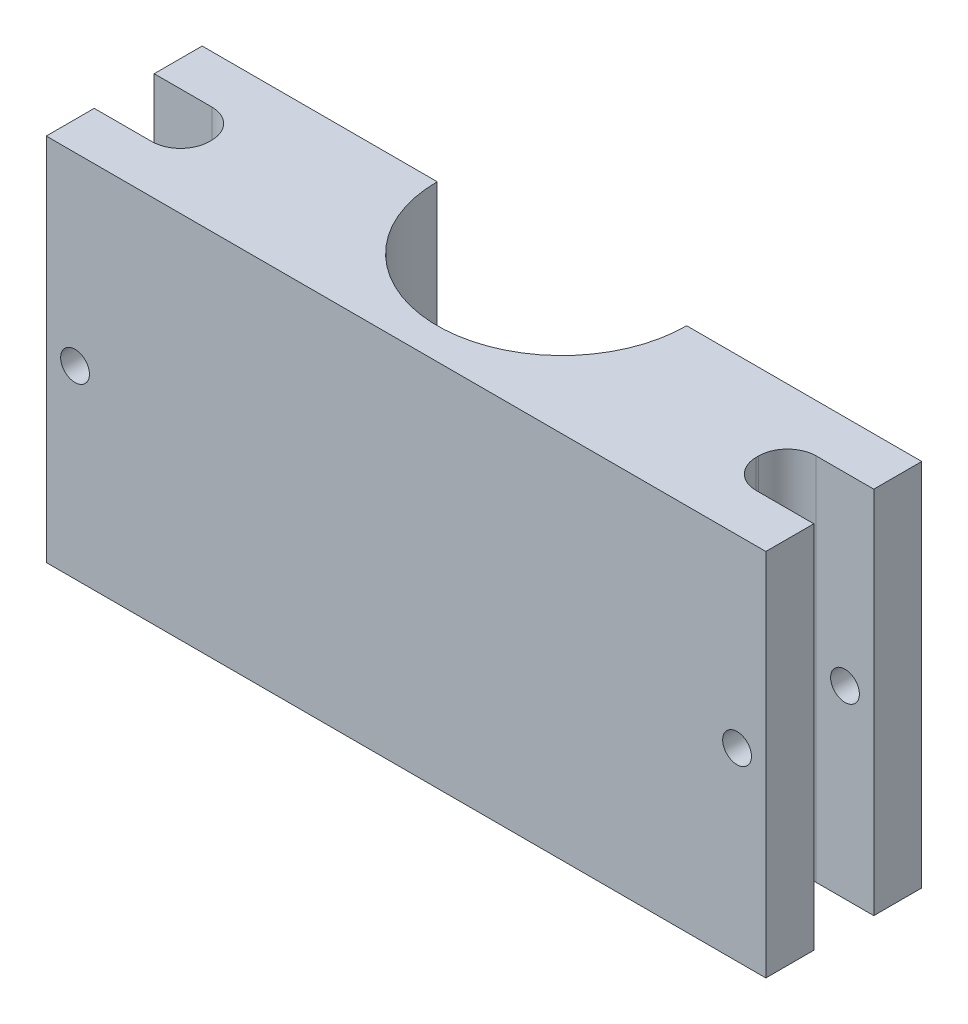
ISO-10303-21;
HEADER;
FILE_DESCRIPTION(('STEP AP214'),'2;1');
FILE_NAME('part.step','',(''),(''),'','','');
FILE_SCHEMA(('AUTOMOTIVE_DESIGN { 1 0 10303 214 1 1 1 1 }'));
ENDSEC;
DATA;
#1=APPLICATION_CONTEXT('core data for automotive mechanical design processes');
#2=APPLICATION_PROTOCOL_DEFINITION('international standard','automotive_design',2000,#1);
#3=PRODUCT_CONTEXT('',#1,'mechanical');
#4=PRODUCT('Part','Part','',(#3));
#5=PRODUCT_RELATED_PRODUCT_CATEGORY('part','',(#4));
#6=PRODUCT_DEFINITION_FORMATION('','',#4);
#7=PRODUCT_DEFINITION_CONTEXT('part definition',#1,'design');
#8=PRODUCT_DEFINITION('design','',#6,#7);
#9=PRODUCT_DEFINITION_SHAPE('','',#8);
#10=(LENGTH_UNIT() NAMED_UNIT(*) SI_UNIT(.MILLI.,.METRE.));
#11=(NAMED_UNIT(*) PLANE_ANGLE_UNIT() SI_UNIT($,.RADIAN.));
#12=(NAMED_UNIT(*) SI_UNIT($,.STERADIAN.) SOLID_ANGLE_UNIT());
#13=UNCERTAINTY_MEASURE_WITH_UNIT(LENGTH_MEASURE(1.E-05),#10,'distance_accuracy_value','');
#14=(GEOMETRIC_REPRESENTATION_CONTEXT(3) GLOBAL_UNCERTAINTY_ASSIGNED_CONTEXT((#13)) GLOBAL_UNIT_ASSIGNED_CONTEXT((#10,
#11,#12)) REPRESENTATION_CONTEXT('',''));
#15=CARTESIAN_POINT('',(0.,0.,0.));
#16=DIRECTION('',(0.,0.,1.));
#17=DIRECTION('',(1.,0.,0.));
#18=AXIS2_PLACEMENT_3D('',#15,#16,#17);
#19=CARTESIAN_POINT('',(0.,-38.5,32.5));
#20=DIRECTION('',(0.,0.,1.));
#21=DIRECTION('',(1.,0.,0.));
#22=AXIS2_PLACEMENT_3D('',#19,#20,#21);
#23=PLANE('',#22);
#24=CARTESIAN_POINT('',(69.,0.,32.5));
#25=DIRECTION('',(0.,0.,1.));
#26=DIRECTION('',(1.,0.,0.));
#27=AXIS2_PLACEMENT_3D('',#24,#25,#26);
#28=CIRCLE('',#27,3.00000000000001);
#29=CARTESIAN_POINT('',(72.,0.,32.5));
#30=VERTEX_POINT('',#29);
#31=EDGE_CURVE('E497',#30,#30,#28,.F.);
#32=ORIENTED_EDGE('',*,*,#31,.T.);
#33=EDGE_LOOP('',(#32));
#34=FACE_BOUND('',#33,.T.);
#35=DIRECTION('',(0.,1.,0.));
#36=VECTOR('',#35,1.);
#37=CARTESIAN_POINT('',(75.,-38.5,32.5));
#38=LINE('',#37,#36);
#39=CARTESIAN_POINT('',(75.,-38.5,32.5));
#40=VERTEX_POINT('',#39);
#41=CARTESIAN_POINT('',(75.,38.5,32.5));
#42=VERTEX_POINT('',#41);
#43=EDGE_CURVE('E325',#40,#42,#38,.T.);
#44=ORIENTED_EDGE('',*,*,#43,.T.);
#45=DIRECTION('',(1.,0.,0.));
#46=VECTOR('',#45,1.);
#47=CARTESIAN_POINT('',(0.,38.5,32.5));
#48=LINE('',#47,#46);
#49=CARTESIAN_POINT('',(-75.,38.5,32.5));
#50=VERTEX_POINT('',#49);
#51=EDGE_CURVE('E238',#50,#42,#48,.T.);
#52=ORIENTED_EDGE('',*,*,#51,.F.);
#53=DIRECTION('',(0.,1.,0.));
#54=VECTOR('',#53,1.);
#55=CARTESIAN_POINT('',(-75.,-38.5,32.5));
#56=LINE('',#55,#54);
#57=CARTESIAN_POINT('',(-75.,-38.5,32.5));
#58=VERTEX_POINT('',#57);
#59=EDGE_CURVE('E328',#58,#50,#56,.T.);
#60=ORIENTED_EDGE('',*,*,#59,.F.);
#61=DIRECTION('',(1.,0.,0.));
#62=VECTOR('',#61,1.);
#63=CARTESIAN_POINT('',(0.,-38.5,32.5));
#64=LINE('',#63,#62);
#65=EDGE_CURVE('E302',#58,#40,#64,.T.);
#66=ORIENTED_EDGE('',*,*,#65,.T.);
#67=EDGE_LOOP('',(#44,#52,#60,#66));
#68=FACE_BOUND('',#67,.T.);
#69=CARTESIAN_POINT('',(-69.,0.,32.5));
#70=DIRECTION('',(0.,0.,1.));
#71=DIRECTION('',(1.,0.,0.));
#72=AXIS2_PLACEMENT_3D('',#69,#70,#71);
#73=CIRCLE('',#72,3.00000000000001);
#74=CARTESIAN_POINT('',(-66.,0.,32.5));
#75=VERTEX_POINT('',#74);
#76=EDGE_CURVE('E486',#75,#75,#73,.T.);
#77=ORIENTED_EDGE('',*,*,#76,.F.);
#78=EDGE_LOOP('',(#77));
#79=FACE_BOUND('',#78,.T.);
#80=ADVANCED_FACE('F41',(#34,#68,#79),#23,.T.);
#81=CARTESIAN_POINT('',(63.,-38.5,16.));
#82=DIRECTION('',(0.,1.,0.));
#83=DIRECTION('',(0.,0.,1.));
#84=AXIS2_PLACEMENT_3D('',#81,#82,#83);
#85=CYLINDRICAL_SURFACE('',#84,6.00000000000002);
#86=DIRECTION('',(0.,1.,0.));
#87=VECTOR('',#86,1.);
#88=CARTESIAN_POINT('',(63.,-38.5,10.));
#89=LINE('',#88,#87);
#90=CARTESIAN_POINT('',(63.,-38.5,10.));
#91=VERTEX_POINT('',#90);
#92=CARTESIAN_POINT('',(63.,38.5,10.));
#93=VERTEX_POINT('',#92);
#94=EDGE_CURVE('E166',#91,#93,#89,.T.);
#95=ORIENTED_EDGE('',*,*,#94,.T.);
#96=CARTESIAN_POINT('',(63.,38.5,16.));
#97=DIRECTION('',(0.,1.,0.));
#98=DIRECTION('',(0.,0.,1.));
#99=AXIS2_PLACEMENT_3D('',#96,#97,#98);
#100=CIRCLE('',#99,6.00000000000002);
#101=CARTESIAN_POINT('',(57.,38.5,16.));
#102=VERTEX_POINT('',#101);
#103=EDGE_CURVE('E169',#93,#102,#100,.T.);
#104=ORIENTED_EDGE('',*,*,#103,.T.);
#105=DIRECTION('',(0.,1.,0.));
#106=VECTOR('',#105,1.);
#107=CARTESIAN_POINT('',(57.,-38.5,16.));
#108=LINE('',#107,#106);
#109=CARTESIAN_POINT('',(57.,-38.5,16.));
#110=VERTEX_POINT('',#109);
#111=EDGE_CURVE('E11',#110,#102,#108,.T.);
#112=ORIENTED_EDGE('',*,*,#111,.F.);
#113=CARTESIAN_POINT('',(63.,-38.5,16.));
#114=DIRECTION('',(0.,1.,0.));
#115=DIRECTION('',(0.,0.,1.));
#116=AXIS2_PLACEMENT_3D('',#113,#114,#115);
#117=CIRCLE('',#116,6.00000000000002);
#118=EDGE_CURVE('E171',#91,#110,#117,.T.);
#119=ORIENTED_EDGE('',*,*,#118,.F.);
#120=EDGE_LOOP('',(#95,#104,#112,#119));
#121=FACE_BOUND('',#120,.T.);
#122=ADVANCED_FACE('F43',(#121),#85,.F.);
#123=CARTESIAN_POINT('',(56.9999999999998,-38.5,-7.91033905045442E-13));
#124=DIRECTION('',(-1.,0.,0.));
#125=DIRECTION('',(0.,0.,1.));
#126=AXIS2_PLACEMENT_3D('',#123,#124,#125);
#127=PLANE('',#126);
#128=ORIENTED_EDGE('',*,*,#111,.T.);
#129=DIRECTION('',(0.,0.,1.));
#130=VECTOR('',#129,1.);
#131=CARTESIAN_POINT('',(56.9999999999998,38.5,-7.91033905045442E-13));
#132=LINE('',#131,#130);
#133=CARTESIAN_POINT('',(57.,38.5,16.5));
#134=VERTEX_POINT('',#133);
#135=EDGE_CURVE('E185',#102,#134,#132,.T.);
#136=ORIENTED_EDGE('',*,*,#135,.T.);
#137=DIRECTION('',(0.,1.,0.));
#138=VECTOR('',#137,1.);
#139=CARTESIAN_POINT('',(57.,-38.5,16.5));
#140=LINE('',#139,#138);
#141=CARTESIAN_POINT('',(57.,-38.5,16.5));
#142=VERTEX_POINT('',#141);
#143=EDGE_CURVE('E51',#142,#134,#140,.T.);
#144=ORIENTED_EDGE('',*,*,#143,.F.);
#145=DIRECTION('',(0.,0.,1.));
#146=VECTOR('',#145,1.);
#147=CARTESIAN_POINT('',(56.9999999999998,-38.5,-7.91033905045442E-13));
#148=LINE('',#147,#146);
#149=EDGE_CURVE('E58',#110,#142,#148,.T.);
#150=ORIENTED_EDGE('',*,*,#149,.F.);
#151=EDGE_LOOP('',(#128,#136,#144,#150));
#152=FACE_BOUND('',#151,.T.);
#153=ADVANCED_FACE('F425',(#152),#127,.F.);
#154=CARTESIAN_POINT('',(63.,-38.5,16.5));
#155=DIRECTION('',(0.,1.,0.));
#156=DIRECTION('',(0.,0.,1.));
#157=AXIS2_PLACEMENT_3D('',#154,#155,#156);
#158=CYLINDRICAL_SURFACE('',#157,6.);
#159=ORIENTED_EDGE('',*,*,#143,.T.);
#160=CARTESIAN_POINT('',(63.,38.5,16.5));
#161=DIRECTION('',(0.,1.,0.));
#162=DIRECTION('',(0.,0.,1.));
#163=AXIS2_PLACEMENT_3D('',#160,#161,#162);
#164=CIRCLE('',#163,6.);
#165=CARTESIAN_POINT('',(63.,38.5,22.5));
#166=VERTEX_POINT('',#165);
#167=EDGE_CURVE('E250',#134,#166,#164,.T.);
#168=ORIENTED_EDGE('',*,*,#167,.T.);
#169=DIRECTION('',(0.,1.,0.));
#170=VECTOR('',#169,1.);
#171=CARTESIAN_POINT('',(63.,-38.5,22.5));
#172=LINE('',#171,#170);
#173=CARTESIAN_POINT('',(63.,-38.5,22.5));
#174=VERTEX_POINT('',#173);
#175=EDGE_CURVE('E319',#174,#166,#172,.T.);
#176=ORIENTED_EDGE('',*,*,#175,.F.);
#177=CARTESIAN_POINT('',(63.,-38.5,16.5));
#178=DIRECTION('',(0.,1.,0.));
#179=DIRECTION('',(0.,0.,1.));
#180=AXIS2_PLACEMENT_3D('',#177,#178,#179);
#181=CIRCLE('',#180,6.);
#182=EDGE_CURVE('E312',#142,#174,#181,.T.);
#183=ORIENTED_EDGE('',*,*,#182,.F.);
#184=EDGE_LOOP('',(#159,#168,#176,#183));
#185=FACE_BOUND('',#184,.T.);
#186=ADVANCED_FACE('F424',(#185),#158,.F.);
#187=CARTESIAN_POINT('',(0.,-38.5,22.5));
#188=DIRECTION('',(0.,0.,1.));
#189=DIRECTION('',(1.,0.,0.));
#190=AXIS2_PLACEMENT_3D('',#187,#188,#189);
#191=PLANE('',#190);
#192=CARTESIAN_POINT('',(69.,0.,22.5));
#193=DIRECTION('',(0.,0.,1.));
#194=DIRECTION('',(1.,0.,0.));
#195=AXIS2_PLACEMENT_3D('',#192,#193,#194);
#196=CIRCLE('',#195,3.00000000000001);
#197=CARTESIAN_POINT('',(72.,0.,22.5));
#198=VERTEX_POINT('',#197);
#199=EDGE_CURVE('E478',#198,#198,#196,.F.);
#200=ORIENTED_EDGE('',*,*,#199,.F.);
#201=EDGE_LOOP('',(#200));
#202=FACE_BOUND('',#201,.T.);
#203=ORIENTED_EDGE('',*,*,#175,.T.);
#204=DIRECTION('',(1.,0.,0.));
#205=VECTOR('',#204,1.);
#206=CARTESIAN_POINT('',(0.,38.5,22.5));
#207=LINE('',#206,#205);
#208=CARTESIAN_POINT('',(75.,38.5,22.5));
#209=VERTEX_POINT('',#208);
#210=EDGE_CURVE('E246',#166,#209,#207,.T.);
#211=ORIENTED_EDGE('',*,*,#210,.T.);
#212=DIRECTION('',(0.,1.,0.));
#213=VECTOR('',#212,1.);
#214=CARTESIAN_POINT('',(75.,-38.5,22.5));
#215=LINE('',#214,#213);
#216=CARTESIAN_POINT('',(75.,-38.5,22.5));
#217=VERTEX_POINT('',#216);
#218=EDGE_CURVE('E322',#217,#209,#215,.T.);
#219=ORIENTED_EDGE('',*,*,#218,.F.);
#220=DIRECTION('',(1.,0.,0.));
#221=VECTOR('',#220,1.);
#222=CARTESIAN_POINT('',(0.,-38.5,22.5));
#223=LINE('',#222,#221);
#224=EDGE_CURVE('E309',#174,#217,#223,.T.);
#225=ORIENTED_EDGE('',*,*,#224,.F.);
#226=EDGE_LOOP('',(#203,#211,#219,#225));
#227=FACE_BOUND('',#226,.T.);
#228=ADVANCED_FACE('F420',(#202,#227),#191,.F.);
#229=CARTESIAN_POINT('',(75.,-38.5,0.));
#230=DIRECTION('',(-1.,0.,0.));
#231=DIRECTION('',(0.,0.,1.));
#232=AXIS2_PLACEMENT_3D('',#229,#230,#231);
#233=PLANE('',#232);
#234=ORIENTED_EDGE('',*,*,#218,.T.);
#235=DIRECTION('',(0.,0.,1.));
#236=VECTOR('',#235,1.);
#237=CARTESIAN_POINT('',(75.,38.5,0.));
#238=LINE('',#237,#236);
#239=EDGE_CURVE('E242',#209,#42,#238,.T.);
#240=ORIENTED_EDGE('',*,*,#239,.T.);
#241=ORIENTED_EDGE('',*,*,#43,.F.);
#242=DIRECTION('',(0.,0.,1.));
#243=VECTOR('',#242,1.);
#244=CARTESIAN_POINT('',(75.,-38.5,0.));
#245=LINE('',#244,#243);
#246=EDGE_CURVE('E306',#217,#40,#245,.T.);
#247=ORIENTED_EDGE('',*,*,#246,.F.);
#248=EDGE_LOOP('',(#234,#240,#241,#247));
#249=FACE_BOUND('',#248,.T.);
#250=ADVANCED_FACE('F416',(#249),#233,.F.);
#251=CARTESIAN_POINT('',(-75.,-38.5,0.));
#252=DIRECTION('',(-1.,0.,0.));
#253=DIRECTION('',(0.,0.,1.));
#254=AXIS2_PLACEMENT_3D('',#251,#252,#253);
#255=PLANE('',#254);
#256=ORIENTED_EDGE('',*,*,#59,.T.);
#257=DIRECTION('',(0.,0.,1.));
#258=VECTOR('',#257,1.);
#259=CARTESIAN_POINT('',(-75.,38.5,0.));
#260=LINE('',#259,#258);
#261=CARTESIAN_POINT('',(-75.,38.5,22.5));
#262=VERTEX_POINT('',#261);
#263=EDGE_CURVE('E234',#262,#50,#260,.T.);
#264=ORIENTED_EDGE('',*,*,#263,.F.);
#265=DIRECTION('',(0.,1.,0.));
#266=VECTOR('',#265,1.);
#267=CARTESIAN_POINT('',(-75.,-38.5,22.5));
#268=LINE('',#267,#266);
#269=CARTESIAN_POINT('',(-75.,-38.5,22.5));
#270=VERTEX_POINT('',#269);
#271=EDGE_CURVE('E331',#270,#262,#268,.T.);
#272=ORIENTED_EDGE('',*,*,#271,.F.);
#273=DIRECTION('',(0.,0.,1.));
#274=VECTOR('',#273,1.);
#275=CARTESIAN_POINT('',(-75.,-38.5,0.));
#276=LINE('',#275,#274);
#277=EDGE_CURVE('E298',#270,#58,#276,.T.);
#278=ORIENTED_EDGE('',*,*,#277,.T.);
#279=EDGE_LOOP('',(#256,#264,#272,#278));
#280=FACE_BOUND('',#279,.T.);
#281=ADVANCED_FACE('F408',(#280),#255,.T.);
#282=CARTESIAN_POINT('',(0.,-38.5,22.5));
#283=DIRECTION('',(0.,0.,-1.));
#284=DIRECTION('',(-1.,0.,0.));
#285=AXIS2_PLACEMENT_3D('',#282,#283,#284);
#286=PLANE('',#285);
#287=CARTESIAN_POINT('',(-69.,0.,22.5));
#288=DIRECTION('',(0.,0.,-1.));
#289=DIRECTION('',(-1.,0.,0.));
#290=AXIS2_PLACEMENT_3D('',#287,#288,#289);
#291=CIRCLE('',#290,3.00000000000001);
#292=CARTESIAN_POINT('',(-72.,0.,22.5));
#293=VERTEX_POINT('',#292);
#294=EDGE_CURVE('E187',#293,#293,#291,.T.);
#295=ORIENTED_EDGE('',*,*,#294,.F.);
#296=EDGE_LOOP('',(#295));
#297=FACE_BOUND('',#296,.T.);
#298=ORIENTED_EDGE('',*,*,#271,.T.);
#299=DIRECTION('',(-1.,0.,0.));
#300=VECTOR('',#299,1.);
#301=CARTESIAN_POINT('',(0.,38.5,22.5));
#302=LINE('',#301,#300);
#303=CARTESIAN_POINT('',(-63.,38.5,22.5));
#304=VERTEX_POINT('',#303);
#305=EDGE_CURVE('E230',#304,#262,#302,.T.);
#306=ORIENTED_EDGE('',*,*,#305,.F.);
#307=DIRECTION('',(0.,1.,0.));
#308=VECTOR('',#307,1.);
#309=CARTESIAN_POINT('',(-63.,-38.5,22.5));
#310=LINE('',#309,#308);
#311=CARTESIAN_POINT('',(-63.,-38.5,22.5));
#312=VERTEX_POINT('',#311);
#313=EDGE_CURVE('E334',#312,#304,#310,.T.);
#314=ORIENTED_EDGE('',*,*,#313,.F.);
#315=DIRECTION('',(-1.,0.,0.));
#316=VECTOR('',#315,1.);
#317=CARTESIAN_POINT('',(0.,-38.5,22.5));
#318=LINE('',#317,#316);
#319=EDGE_CURVE('E294',#312,#270,#318,.T.);
#320=ORIENTED_EDGE('',*,*,#319,.T.);
#321=EDGE_LOOP('',(#298,#306,#314,#320));
#322=FACE_BOUND('',#321,.T.);
#323=ADVANCED_FACE('F403',(#297,#322),#286,.T.);
#324=CARTESIAN_POINT('',(-63.,-38.5,16.5));
#325=DIRECTION('',(0.,1.,0.));
#326=DIRECTION('',(0.,0.,1.));
#327=AXIS2_PLACEMENT_3D('',#324,#325,#326);
#328=CYLINDRICAL_SURFACE('',#327,6.);
#329=ORIENTED_EDGE('',*,*,#313,.T.);
#330=CARTESIAN_POINT('',(-63.,38.5,16.5));
#331=DIRECTION('',(0.,1.,0.));
#332=DIRECTION('',(0.,0.,1.));
#333=AXIS2_PLACEMENT_3D('',#330,#331,#332);
#334=CIRCLE('',#333,6.);
#335=CARTESIAN_POINT('',(-57.,38.5,16.5));
#336=VERTEX_POINT('',#335);
#337=EDGE_CURVE('E226',#336,#304,#334,.F.);
#338=ORIENTED_EDGE('',*,*,#337,.F.);
#339=DIRECTION('',(0.,1.,0.));
#340=VECTOR('',#339,1.);
#341=CARTESIAN_POINT('',(-57.,-38.5,16.5));
#342=LINE('',#341,#340);
#343=CARTESIAN_POINT('',(-57.,-38.5,16.5));
#344=VERTEX_POINT('',#343);
#345=EDGE_CURVE('E337',#344,#336,#342,.T.);
#346=ORIENTED_EDGE('',*,*,#345,.F.);
#347=CARTESIAN_POINT('',(-63.,-38.5,16.5));
#348=DIRECTION('',(0.,1.,0.));
#349=DIRECTION('',(0.,0.,1.));
#350=AXIS2_PLACEMENT_3D('',#347,#348,#349);
#351=CIRCLE('',#350,6.);
#352=EDGE_CURVE('E290',#344,#312,#351,.F.);
#353=ORIENTED_EDGE('',*,*,#352,.T.);
#354=EDGE_LOOP('',(#329,#338,#346,#353));
#355=FACE_BOUND('',#354,.T.);
#356=ADVANCED_FACE('F398',(#355),#328,.F.);
#357=CARTESIAN_POINT('',(-56.9999999999998,-38.5,-7.91033905045442E-13));
#358=DIRECTION('',(-1.,0.,0.));
#359=DIRECTION('',(0.,0.,1.));
#360=AXIS2_PLACEMENT_3D('',#357,#358,#359);
#361=PLANE('',#360);
#362=ORIENTED_EDGE('',*,*,#345,.T.);
#363=DIRECTION('',(0.,0.,1.));
#364=VECTOR('',#363,1.);
#365=CARTESIAN_POINT('',(-56.9999999999998,38.5,-7.91033905045442E-13));
#366=LINE('',#365,#364);
#367=CARTESIAN_POINT('',(-57.,38.5,16.));
#368=VERTEX_POINT('',#367);
#369=EDGE_CURVE('E222',#368,#336,#366,.T.);
#370=ORIENTED_EDGE('',*,*,#369,.F.);
#371=DIRECTION('',(0.,1.,0.));
#372=VECTOR('',#371,1.);
#373=CARTESIAN_POINT('',(-57.,-38.5,16.));
#374=LINE('',#373,#372);
#375=CARTESIAN_POINT('',(-57.,-38.5,16.));
#376=VERTEX_POINT('',#375);
#377=EDGE_CURVE('E340',#376,#368,#374,.T.);
#378=ORIENTED_EDGE('',*,*,#377,.F.);
#379=DIRECTION('',(0.,0.,1.));
#380=VECTOR('',#379,1.);
#381=CARTESIAN_POINT('',(-56.9999999999998,-38.5,-7.91033905045442E-13));
#382=LINE('',#381,#380);
#383=EDGE_CURVE('E286',#376,#344,#382,.T.);
#384=ORIENTED_EDGE('',*,*,#383,.T.);
#385=EDGE_LOOP('',(#362,#370,#378,#384));
#386=FACE_BOUND('',#385,.T.);
#387=ADVANCED_FACE('F396',(#386),#361,.T.);
#388=CARTESIAN_POINT('',(-63.,-38.5,16.));
#389=DIRECTION('',(0.,1.,0.));
#390=DIRECTION('',(0.,0.,1.));
#391=AXIS2_PLACEMENT_3D('',#388,#389,#390);
#392=CYLINDRICAL_SURFACE('',#391,6.00000000000002);
#393=ORIENTED_EDGE('',*,*,#377,.T.);
#394=CARTESIAN_POINT('',(-63.,38.5,16.));
#395=DIRECTION('',(0.,1.,0.));
#396=DIRECTION('',(0.,0.,1.));
#397=AXIS2_PLACEMENT_3D('',#394,#395,#396);
#398=CIRCLE('',#397,6.00000000000002);
#399=CARTESIAN_POINT('',(-63.,38.5,10.));
#400=VERTEX_POINT('',#399);
#401=EDGE_CURVE('E218',#400,#368,#398,.F.);
#402=ORIENTED_EDGE('',*,*,#401,.F.);
#403=DIRECTION('',(0.,1.,0.));
#404=VECTOR('',#403,1.);
#405=CARTESIAN_POINT('',(-63.,-38.5,10.));
#406=LINE('',#405,#404);
#407=CARTESIAN_POINT('',(-63.,-38.5,10.));
#408=VERTEX_POINT('',#407);
#409=EDGE_CURVE('E343',#408,#400,#406,.T.);
#410=ORIENTED_EDGE('',*,*,#409,.F.);
#411=CARTESIAN_POINT('',(-63.,-38.5,16.));
#412=DIRECTION('',(0.,1.,0.));
#413=DIRECTION('',(0.,0.,1.));
#414=AXIS2_PLACEMENT_3D('',#411,#412,#413);
#415=CIRCLE('',#414,6.00000000000002);
#416=EDGE_CURVE('E282',#408,#376,#415,.F.);
#417=ORIENTED_EDGE('',*,*,#416,.T.);
#418=EDGE_LOOP('',(#393,#402,#410,#417));
#419=FACE_BOUND('',#418,.T.);
#420=ADVANCED_FACE('F391',(#419),#392,.F.);
#421=CARTESIAN_POINT('',(0.,-38.5,9.99999999999999));
#422=DIRECTION('',(0.,0.,1.));
#423=DIRECTION('',(1.,0.,0.));
#424=AXIS2_PLACEMENT_3D('',#421,#422,#423);
#425=PLANE('',#424);
#426=CARTESIAN_POINT('',(-69.,0.,10.));
#427=DIRECTION('',(0.,0.,1.));
#428=DIRECTION('',(1.,0.,0.));
#429=AXIS2_PLACEMENT_3D('',#426,#427,#428);
#430=CIRCLE('',#429,3.00000000000001);
#431=CARTESIAN_POINT('',(-66.,0.,10.));
#432=VERTEX_POINT('',#431);
#433=EDGE_CURVE('E483',#432,#432,#430,.T.);
#434=ORIENTED_EDGE('',*,*,#433,.F.);
#435=EDGE_LOOP('',(#434));
#436=FACE_BOUND('',#435,.T.);
#437=ORIENTED_EDGE('',*,*,#409,.T.);
#438=DIRECTION('',(1.,0.,0.));
#439=VECTOR('',#438,1.);
#440=CARTESIAN_POINT('',(0.,38.5,9.99999999999999));
#441=LINE('',#440,#439);
#442=CARTESIAN_POINT('',(-75.,38.5,10.));
#443=VERTEX_POINT('',#442);
#444=EDGE_CURVE('E214',#443,#400,#441,.T.);
#445=ORIENTED_EDGE('',*,*,#444,.F.);
#446=DIRECTION('',(0.,1.,0.));
#447=VECTOR('',#446,1.);
#448=CARTESIAN_POINT('',(-75.,-38.5,10.));
#449=LINE('',#448,#447);
#450=CARTESIAN_POINT('',(-75.,-38.5,10.));
#451=VERTEX_POINT('',#450);
#452=EDGE_CURVE('E346',#451,#443,#449,.T.);
#453=ORIENTED_EDGE('',*,*,#452,.F.);
#454=DIRECTION('',(1.,0.,0.));
#455=VECTOR('',#454,1.);
#456=CARTESIAN_POINT('',(0.,-38.5,9.99999999999999));
#457=LINE('',#456,#455);
#458=EDGE_CURVE('E278',#451,#408,#457,.T.);
#459=ORIENTED_EDGE('',*,*,#458,.T.);
#460=EDGE_LOOP('',(#437,#445,#453,#459));
#461=FACE_BOUND('',#460,.T.);
#462=ADVANCED_FACE('F385',(#436,#461),#425,.T.);
#463=CARTESIAN_POINT('',(-75.,-38.5,0.));
#464=DIRECTION('',(-1.,0.,0.));
#465=DIRECTION('',(0.,0.,1.));
#466=AXIS2_PLACEMENT_3D('',#463,#464,#465);
#467=PLANE('',#466);
#468=ORIENTED_EDGE('',*,*,#452,.T.);
#469=DIRECTION('',(0.,0.,1.));
#470=VECTOR('',#469,1.);
#471=CARTESIAN_POINT('',(-75.,38.5,0.));
#472=LINE('',#471,#470);
#473=CARTESIAN_POINT('',(-75.,38.5,0.));
#474=VERTEX_POINT('',#473);
#475=EDGE_CURVE('E210',#474,#443,#472,.T.);
#476=ORIENTED_EDGE('',*,*,#475,.F.);
#477=DIRECTION('',(0.,1.,0.));
#478=VECTOR('',#477,1.);
#479=CARTESIAN_POINT('',(-75.,-38.5,0.));
#480=LINE('',#479,#478);
#481=CARTESIAN_POINT('',(-75.,-38.5,0.));
#482=VERTEX_POINT('',#481);
#483=EDGE_CURVE('E349',#482,#474,#480,.T.);
#484=ORIENTED_EDGE('',*,*,#483,.F.);
#485=DIRECTION('',(0.,0.,1.));
#486=VECTOR('',#485,1.);
#487=CARTESIAN_POINT('',(-75.,-38.5,0.));
#488=LINE('',#487,#486);
#489=EDGE_CURVE('E274',#482,#451,#488,.T.);
#490=ORIENTED_EDGE('',*,*,#489,.T.);
#491=EDGE_LOOP('',(#468,#476,#484,#490));
#492=FACE_BOUND('',#491,.T.);
#493=ADVANCED_FACE('F381',(#492),#467,.T.);
#494=CARTESIAN_POINT('',(0.,-38.5,0.));
#495=DIRECTION('',(0.,0.,-1.));
#496=DIRECTION('',(-1.,0.,0.));
#497=AXIS2_PLACEMENT_3D('',#494,#495,#496);
#498=PLANE('',#497);
#499=CARTESIAN_POINT('',(-69.,0.,0.));
#500=DIRECTION('',(0.,0.,1.));
#501=DIRECTION('',(1.,0.,0.));
#502=AXIS2_PLACEMENT_3D('',#499,#500,#501);
#503=CIRCLE('',#502,3.00000000000001);
#504=CARTESIAN_POINT('',(-66.,0.,0.));
#505=VERTEX_POINT('',#504);
#506=EDGE_CURVE('E479',#505,#505,#503,.T.);
#507=ORIENTED_EDGE('',*,*,#506,.T.);
#508=EDGE_LOOP('',(#507));
#509=FACE_BOUND('',#508,.T.);
#510=ORIENTED_EDGE('',*,*,#483,.T.);
#511=DIRECTION('',(-1.,0.,0.));
#512=VECTOR('',#511,1.);
#513=CARTESIAN_POINT('',(0.,38.5,0.));
#514=LINE('',#513,#512);
#515=CARTESIAN_POINT('',(-26.,38.5,0.));
#516=VERTEX_POINT('',#515);
#517=EDGE_CURVE('E206',#516,#474,#514,.T.);
#518=ORIENTED_EDGE('',*,*,#517,.F.);
#519=DIRECTION('',(0.,1.,0.));
#520=VECTOR('',#519,1.);
#521=CARTESIAN_POINT('',(-26.,-38.5,0.));
#522=LINE('',#521,#520);
#523=CARTESIAN_POINT('',(-26.,-38.5,0.));
#524=VERTEX_POINT('',#523);
#525=EDGE_CURVE('E352',#524,#516,#522,.T.);
#526=ORIENTED_EDGE('',*,*,#525,.F.);
#527=DIRECTION('',(-1.,0.,0.));
#528=VECTOR('',#527,1.);
#529=CARTESIAN_POINT('',(0.,-38.5,0.));
#530=LINE('',#529,#528);
#531=EDGE_CURVE('E270',#524,#482,#530,.T.);
#532=ORIENTED_EDGE('',*,*,#531,.T.);
#533=EDGE_LOOP('',(#510,#518,#526,#532));
#534=FACE_BOUND('',#533,.T.);
#535=ADVANCED_FACE('F459',(#509,#534),#498,.T.);
#536=CARTESIAN_POINT('',(0.,-38.5,0.));
#537=DIRECTION('',(0.,1.,0.));
#538=DIRECTION('',(0.,0.,1.));
#539=AXIS2_PLACEMENT_3D('',#536,#537,#538);
#540=CYLINDRICAL_SURFACE('',#539,26.);
#541=ORIENTED_EDGE('',*,*,#525,.T.);
#542=CARTESIAN_POINT('',(0.,38.5,0.));
#543=DIRECTION('',(0.,1.,0.));
#544=DIRECTION('',(0.,0.,1.));
#545=AXIS2_PLACEMENT_3D('',#542,#543,#544);
#546=CIRCLE('',#545,26.);
#547=CARTESIAN_POINT('',(26.,38.5,0.));
#548=VERTEX_POINT('',#547);
#549=EDGE_CURVE('E202',#516,#548,#546,.T.);
#550=ORIENTED_EDGE('',*,*,#549,.T.);
#551=DIRECTION('',(0.,1.,0.));
#552=VECTOR('',#551,1.);
#553=CARTESIAN_POINT('',(26.,-38.5,0.));
#554=LINE('',#553,#552);
#555=CARTESIAN_POINT('',(26.,-38.5,0.));
#556=VERTEX_POINT('',#555);
#557=EDGE_CURVE('E355',#556,#548,#554,.T.);
#558=ORIENTED_EDGE('',*,*,#557,.F.);
#559=CARTESIAN_POINT('',(0.,-38.5,0.));
#560=DIRECTION('',(0.,1.,0.));
#561=DIRECTION('',(0.,0.,1.));
#562=AXIS2_PLACEMENT_3D('',#559,#560,#561);
#563=CIRCLE('',#562,26.);
#564=EDGE_CURVE('E267',#524,#556,#563,.T.);
#565=ORIENTED_EDGE('',*,*,#564,.F.);
#566=EDGE_LOOP('',(#541,#550,#558,#565));
#567=FACE_BOUND('',#566,.T.);
#568=ADVANCED_FACE('F374',(#567),#540,.F.);
#569=CARTESIAN_POINT('',(0.,-38.5,0.));
#570=DIRECTION('',(0.,0.,1.));
#571=DIRECTION('',(1.,0.,0.));
#572=AXIS2_PLACEMENT_3D('',#569,#570,#571);
#573=PLANE('',#572);
#574=CARTESIAN_POINT('',(69.,0.,0.));
#575=DIRECTION('',(0.,0.,1.));
#576=DIRECTION('',(1.,0.,0.));
#577=AXIS2_PLACEMENT_3D('',#574,#575,#576);
#578=CIRCLE('',#577,3.00000000000001);
#579=CARTESIAN_POINT('',(72.,0.,0.));
#580=VERTEX_POINT('',#579);
#581=EDGE_CURVE('E491',#580,#580,#578,.F.);
#582=ORIENTED_EDGE('',*,*,#581,.F.);
#583=EDGE_LOOP('',(#582));
#584=FACE_BOUND('',#583,.T.);
#585=ORIENTED_EDGE('',*,*,#557,.T.);
#586=DIRECTION('',(1.,0.,0.));
#587=VECTOR('',#586,1.);
#588=CARTESIAN_POINT('',(0.,38.5,0.));
#589=LINE('',#588,#587);
#590=CARTESIAN_POINT('',(75.,38.5,0.));
#591=VERTEX_POINT('',#590);
#592=EDGE_CURVE('E195',#548,#591,#589,.T.);
#593=ORIENTED_EDGE('',*,*,#592,.T.);
#594=DIRECTION('',(0.,1.,0.));
#595=VECTOR('',#594,1.);
#596=CARTESIAN_POINT('',(75.,-38.5,0.));
#597=LINE('',#596,#595);
#598=CARTESIAN_POINT('',(75.,-38.5,0.));
#599=VERTEX_POINT('',#598);
#600=EDGE_CURVE('E358',#599,#591,#597,.T.);
#601=ORIENTED_EDGE('',*,*,#600,.F.);
#602=DIRECTION('',(1.,0.,0.));
#603=VECTOR('',#602,1.);
#604=CARTESIAN_POINT('',(0.,-38.5,0.));
#605=LINE('',#604,#603);
#606=EDGE_CURVE('E264',#556,#599,#605,.T.);
#607=ORIENTED_EDGE('',*,*,#606,.F.);
#608=EDGE_LOOP('',(#585,#593,#601,#607));
#609=FACE_BOUND('',#608,.T.);
#610=ADVANCED_FACE('F370',(#584,#609),#573,.F.);
#611=CARTESIAN_POINT('',(75.,-38.5,0.));
#612=DIRECTION('',(-1.,0.,0.));
#613=DIRECTION('',(0.,0.,1.));
#614=AXIS2_PLACEMENT_3D('',#611,#612,#613);
#615=PLANE('',#614);
#616=ORIENTED_EDGE('',*,*,#600,.T.);
#617=DIRECTION('',(0.,0.,1.));
#618=VECTOR('',#617,1.);
#619=CARTESIAN_POINT('',(75.,38.5,0.));
#620=LINE('',#619,#618);
#621=CARTESIAN_POINT('',(75.,38.5,10.));
#622=VERTEX_POINT('',#621);
#623=EDGE_CURVE('E192',#591,#622,#620,.T.);
#624=ORIENTED_EDGE('',*,*,#623,.T.);
#625=DIRECTION('',(0.,1.,0.));
#626=VECTOR('',#625,1.);
#627=CARTESIAN_POINT('',(75.,-38.5,10.));
#628=LINE('',#627,#626);
#629=CARTESIAN_POINT('',(75.,-38.5,10.));
#630=VERTEX_POINT('',#629);
#631=EDGE_CURVE('E176',#630,#622,#628,.T.);
#632=ORIENTED_EDGE('',*,*,#631,.F.);
#633=DIRECTION('',(0.,0.,1.));
#634=VECTOR('',#633,1.);
#635=CARTESIAN_POINT('',(75.,-38.5,0.));
#636=LINE('',#635,#634);
#637=EDGE_CURVE('E261',#599,#630,#636,.T.);
#638=ORIENTED_EDGE('',*,*,#637,.F.);
#639=EDGE_LOOP('',(#616,#624,#632,#638));
#640=FACE_BOUND('',#639,.T.);
#641=ADVANCED_FACE('F365',(#640),#615,.F.);
#642=CARTESIAN_POINT('',(0.,-38.5,9.99999999999999));
#643=DIRECTION('',(0.,0.,-1.));
#644=DIRECTION('',(-1.,0.,0.));
#645=AXIS2_PLACEMENT_3D('',#642,#643,#644);
#646=PLANE('',#645);
#647=CARTESIAN_POINT('',(69.,0.,10.));
#648=DIRECTION('',(0.,0.,-1.));
#649=DIRECTION('',(-1.,0.,0.));
#650=AXIS2_PLACEMENT_3D('',#647,#648,#649);
#651=CIRCLE('',#650,3.00000000000001);
#652=CARTESIAN_POINT('',(66.,0.,10.));
#653=VERTEX_POINT('',#652);
#654=EDGE_CURVE('E45',#653,#653,#651,.F.);
#655=ORIENTED_EDGE('',*,*,#654,.F.);
#656=EDGE_LOOP('',(#655));
#657=FACE_BOUND('',#656,.T.);
#658=ORIENTED_EDGE('',*,*,#631,.T.);
#659=DIRECTION('',(-1.,0.,0.));
#660=VECTOR('',#659,1.);
#661=CARTESIAN_POINT('',(0.,38.5,9.99999999999999));
#662=LINE('',#661,#660);
#663=EDGE_CURVE('E181',#622,#93,#662,.T.);
#664=ORIENTED_EDGE('',*,*,#663,.T.);
#665=ORIENTED_EDGE('',*,*,#94,.F.);
#666=DIRECTION('',(-1.,0.,0.));
#667=VECTOR('',#666,1.);
#668=CARTESIAN_POINT('',(0.,-38.5,9.99999999999999));
#669=LINE('',#668,#667);
#670=EDGE_CURVE('E258',#630,#91,#669,.T.);
#671=ORIENTED_EDGE('',*,*,#670,.F.);
#672=EDGE_LOOP('',(#658,#664,#665,#671));
#673=FACE_BOUND('',#672,.T.);
#674=ADVANCED_FACE('F189',(#657,#673),#646,.F.);
#675=CARTESIAN_POINT('',(0.,-38.5,0.));
#676=DIRECTION('',(0.,1.,0.));
#677=DIRECTION('',(0.,0.,1.));
#678=AXIS2_PLACEMENT_3D('',#675,#676,#677);
#679=PLANE('',#678);
#680=ORIENTED_EDGE('',*,*,#118,.T.);
#681=ORIENTED_EDGE('',*,*,#149,.T.);
#682=ORIENTED_EDGE('',*,*,#182,.T.);
#683=ORIENTED_EDGE('',*,*,#224,.T.);
#684=ORIENTED_EDGE('',*,*,#246,.T.);
#685=ORIENTED_EDGE('',*,*,#65,.F.);
#686=ORIENTED_EDGE('',*,*,#277,.F.);
#687=ORIENTED_EDGE('',*,*,#319,.F.);
#688=ORIENTED_EDGE('',*,*,#352,.F.);
#689=ORIENTED_EDGE('',*,*,#383,.F.);
#690=ORIENTED_EDGE('',*,*,#416,.F.);
#691=ORIENTED_EDGE('',*,*,#458,.F.);
#692=ORIENTED_EDGE('',*,*,#489,.F.);
#693=ORIENTED_EDGE('',*,*,#531,.F.);
#694=ORIENTED_EDGE('',*,*,#564,.T.);
#695=ORIENTED_EDGE('',*,*,#606,.T.);
#696=ORIENTED_EDGE('',*,*,#637,.T.);
#697=ORIENTED_EDGE('',*,*,#670,.T.);
#698=EDGE_LOOP('',(#680,#681,#682,#683,#684,#685,#686,#687,#688,#689,#690,#691,#692,#693,#694,
#695,#696,#697));
#699=FACE_BOUND('',#698,.T.);
#700=ADVANCED_FACE('F387',(#699),#679,.F.);
#701=CARTESIAN_POINT('',(0.,38.5,0.));
#702=DIRECTION('',(0.,1.,0.));
#703=DIRECTION('',(0.,0.,1.));
#704=AXIS2_PLACEMENT_3D('',#701,#702,#703);
#705=PLANE('',#704);
#706=ORIENTED_EDGE('',*,*,#103,.F.);
#707=ORIENTED_EDGE('',*,*,#663,.F.);
#708=ORIENTED_EDGE('',*,*,#623,.F.);
#709=ORIENTED_EDGE('',*,*,#592,.F.);
#710=ORIENTED_EDGE('',*,*,#549,.F.);
#711=ORIENTED_EDGE('',*,*,#517,.T.);
#712=ORIENTED_EDGE('',*,*,#475,.T.);
#713=ORIENTED_EDGE('',*,*,#444,.T.);
#714=ORIENTED_EDGE('',*,*,#401,.T.);
#715=ORIENTED_EDGE('',*,*,#369,.T.);
#716=ORIENTED_EDGE('',*,*,#337,.T.);
#717=ORIENTED_EDGE('',*,*,#305,.T.);
#718=ORIENTED_EDGE('',*,*,#263,.T.);
#719=ORIENTED_EDGE('',*,*,#51,.T.);
#720=ORIENTED_EDGE('',*,*,#239,.F.);
#721=ORIENTED_EDGE('',*,*,#210,.F.);
#722=ORIENTED_EDGE('',*,*,#167,.F.);
#723=ORIENTED_EDGE('',*,*,#135,.F.);
#724=EDGE_LOOP('',(#706,#707,#708,#709,#710,#711,#712,#713,#714,#715,#716,#717,#718,#719,#720,
#721,#722,#723));
#725=FACE_BOUND('',#724,.T.);
#726=ADVANCED_FACE('F179',(#725),#705,.T.);
#727=CARTESIAN_POINT('',(69.,0.,0.));
#728=DIRECTION('',(0.,0.,1.));
#729=DIRECTION('',(1.,0.,0.));
#730=AXIS2_PLACEMENT_3D('',#727,#728,#729);
#731=CYLINDRICAL_SURFACE('',#730,3.00000000000001);
#732=ORIENTED_EDGE('',*,*,#581,.T.);
#733=EDGE_LOOP('',(#732));
#734=FACE_BOUND('',#733,.T.);
#735=ORIENTED_EDGE('',*,*,#654,.T.);
#736=EDGE_LOOP('',(#735));
#737=FACE_BOUND('',#736,.T.);
#738=ADVANCED_FACE('F519',(#734,#737),#731,.F.);
#739=CARTESIAN_POINT('',(-69.,0.,0.));
#740=DIRECTION('',(0.,0.,1.));
#741=DIRECTION('',(1.,0.,0.));
#742=AXIS2_PLACEMENT_3D('',#739,#740,#741);
#743=CYLINDRICAL_SURFACE('',#742,3.00000000000001);
#744=ORIENTED_EDGE('',*,*,#433,.T.);
#745=EDGE_LOOP('',(#744));
#746=FACE_BOUND('',#745,.T.);
#747=ORIENTED_EDGE('',*,*,#506,.F.);
#748=EDGE_LOOP('',(#747));
#749=FACE_BOUND('',#748,.T.);
#750=ADVANCED_FACE('F510',(#746,#749),#743,.F.);
#751=ORIENTED_EDGE('',*,*,#294,.T.);
#752=EDGE_LOOP('',(#751));
#753=FACE_BOUND('',#752,.T.);
#754=ORIENTED_EDGE('',*,*,#76,.T.);
#755=EDGE_LOOP('',(#754));
#756=FACE_BOUND('',#755,.T.);
#757=ADVANCED_FACE('F506',(#753,#756),#743,.F.);
#758=ORIENTED_EDGE('',*,*,#31,.F.);
#759=EDGE_LOOP('',(#758));
#760=FACE_BOUND('',#759,.T.);
#761=ORIENTED_EDGE('',*,*,#199,.T.);
#762=EDGE_LOOP('',(#761));
#763=FACE_BOUND('',#762,.T.);
#764=ADVANCED_FACE('F509',(#760,#763),#731,.F.);
#765=CLOSED_SHELL('',(#80,#122,#153,#186,#228,#250,#281,#323,#356,#387,#420,#462,#493,#535,#568,
#610,#641,#674,#700,#726,#738,#750,#757,#764));
#766=MANIFOLD_SOLID_BREP('B2',#765);
#767=ADVANCED_BREP_SHAPE_REPRESENTATION('',(#18,#766),#14);
#768=SHAPE_DEFINITION_REPRESENTATION(#9,#767);
ENDSEC;
END-ISO-10303-21;
